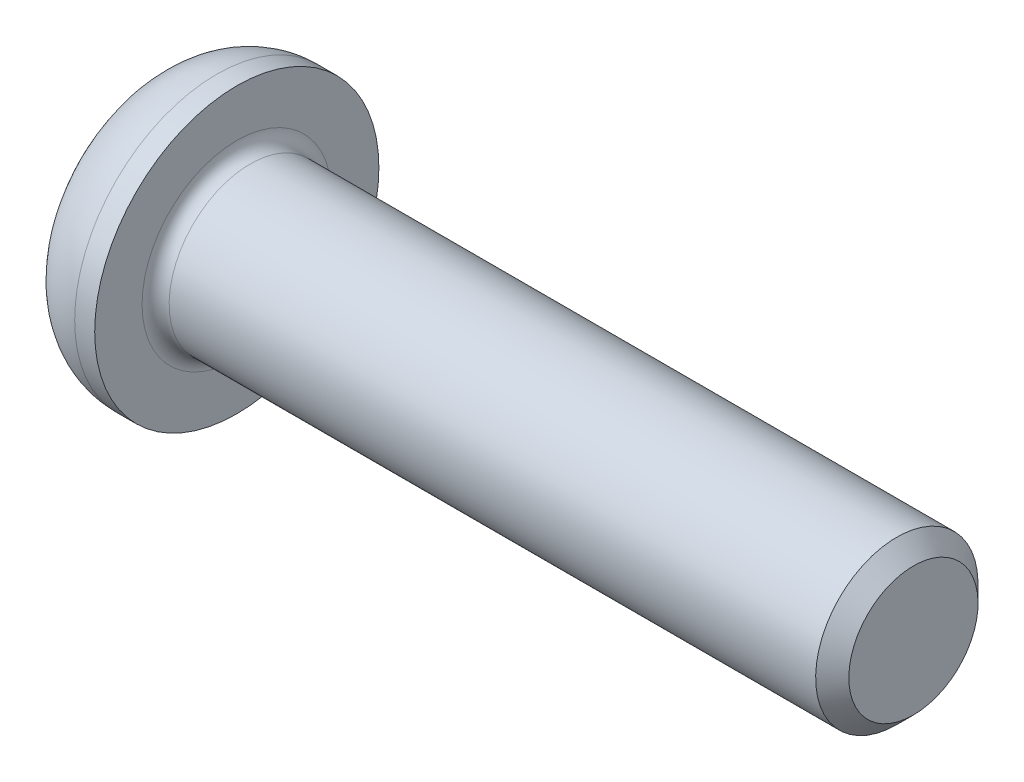
ISO-10303-21;
HEADER;
FILE_DESCRIPTION(('STEP AP214'),'2;1');
FILE_NAME('part.step','',(''),(''),'','','');
FILE_SCHEMA(('AUTOMOTIVE_DESIGN { 1 0 10303 214 1 1 1 1 }'));
ENDSEC;
DATA;
#1=APPLICATION_CONTEXT('core data for automotive mechanical design processes');
#2=APPLICATION_PROTOCOL_DEFINITION('international standard','automotive_design',2000,#1);
#3=PRODUCT_CONTEXT('',#1,'mechanical');
#4=PRODUCT('Part','Part','',(#3));
#5=PRODUCT_RELATED_PRODUCT_CATEGORY('part','',(#4));
#6=PRODUCT_DEFINITION_FORMATION('','',#4);
#7=PRODUCT_DEFINITION_CONTEXT('part definition',#1,'design');
#8=PRODUCT_DEFINITION('design','',#6,#7);
#9=PRODUCT_DEFINITION_SHAPE('','',#8);
#10=(LENGTH_UNIT() NAMED_UNIT(*) SI_UNIT(.MILLI.,.METRE.));
#11=(NAMED_UNIT(*) PLANE_ANGLE_UNIT() SI_UNIT($,.RADIAN.));
#12=(NAMED_UNIT(*) SI_UNIT($,.STERADIAN.) SOLID_ANGLE_UNIT());
#13=UNCERTAINTY_MEASURE_WITH_UNIT(LENGTH_MEASURE(1.E-05),#10,'distance_accuracy_value','');
#14=(GEOMETRIC_REPRESENTATION_CONTEXT(3) GLOBAL_UNCERTAINTY_ASSIGNED_CONTEXT((#13)) GLOBAL_UNIT_ASSIGNED_CONTEXT((#10,
#11,#12)) REPRESENTATION_CONTEXT('',''));
#15=CARTESIAN_POINT('',(0.,0.,0.));
#16=DIRECTION('',(0.,0.,1.));
#17=DIRECTION('',(1.,0.,0.));
#18=AXIS2_PLACEMENT_3D('',#15,#16,#17);
#19=CARTESIAN_POINT('',(25.,0.,0.));
#20=DIRECTION('',(-1.,0.,0.));
#21=DIRECTION('',(0.,-1.,0.));
#22=AXIS2_PLACEMENT_3D('',#19,#20,#21);
#23=PLANE('',#22);
#24=CARTESIAN_POINT('',(25.,0.,0.));
#25=DIRECTION('',(-1.,0.,0.));
#26=DIRECTION('',(0.,-1.,0.));
#27=AXIS2_PLACEMENT_3D('',#24,#25,#26);
#28=CIRCLE('',#27,2.38654999999999);
#29=CARTESIAN_POINT('',(25.,-2.38654999999999,0.));
#30=VERTEX_POINT('',#29);
#31=EDGE_CURVE('E63',#30,#30,#28,.F.);
#32=ORIENTED_EDGE('',*,*,#31,.T.);
#33=EDGE_LOOP('',(#32));
#34=FACE_BOUND('',#33,.T.);
#35=ADVANCED_FACE('F52',(#34),#23,.F.);
#36=CARTESIAN_POINT('',(0.113333333333338,0.,0.));
#37=DIRECTION('',(-1.,0.,0.));
#38=DIRECTION('',(0.,-1.,0.));
#39=AXIS2_PLACEMENT_3D('',#36,#37,#38);
#40=CYLINDRICAL_SURFACE('',#39,3.);
#41=CARTESIAN_POINT('',(0.500000000000002,0.,0.));
#42=DIRECTION('',(-1.,0.,0.));
#43=DIRECTION('',(0.,-1.,0.));
#44=AXIS2_PLACEMENT_3D('',#41,#42,#43);
#45=CIRCLE('',#44,3.);
#46=CARTESIAN_POINT('',(0.500000000000002,-3.,0.));
#47=VERTEX_POINT('',#46);
#48=EDGE_CURVE('E11',#47,#47,#45,.F.);
#49=ORIENTED_EDGE('',*,*,#48,.T.);
#50=EDGE_LOOP('',(#49));
#51=FACE_BOUND('',#50,.T.);
#52=CARTESIAN_POINT('',(24.38655,0.,0.));
#53=DIRECTION('',(-1.,0.,0.));
#54=DIRECTION('',(0.,-1.,0.));
#55=AXIS2_PLACEMENT_3D('',#52,#53,#54);
#56=CIRCLE('',#55,3.);
#57=CARTESIAN_POINT('',(24.38655,-3.,0.));
#58=VERTEX_POINT('',#57);
#59=EDGE_CURVE('E67',#58,#58,#56,.T.);
#60=ORIENTED_EDGE('',*,*,#59,.T.);
#61=EDGE_LOOP('',(#60));
#62=FACE_BOUND('',#61,.T.);
#63=ADVANCED_FACE('F86',(#51,#62),#40,.T.);
#64=CARTESIAN_POINT('',(0.,3.,0.));
#65=DIRECTION('',(-1.,0.,0.));
#66=DIRECTION('',(0.,-1.,0.));
#67=AXIS2_PLACEMENT_3D('',#64,#65,#66);
#68=PLANE('',#67);
#69=CARTESIAN_POINT('',(0.,0.,0.));
#70=DIRECTION('',(-1.,0.,0.));
#71=DIRECTION('',(0.,-1.,0.));
#72=AXIS2_PLACEMENT_3D('',#69,#70,#71);
#73=CIRCLE('',#72,3.5);
#74=CARTESIAN_POINT('',(0.,-3.5,0.));
#75=VERTEX_POINT('',#74);
#76=EDGE_CURVE('E59',#75,#75,#73,.T.);
#77=ORIENTED_EDGE('',*,*,#76,.T.);
#78=EDGE_LOOP('',(#77));
#79=FACE_BOUND('',#78,.T.);
#80=CARTESIAN_POINT('',(0.,0.,0.));
#81=DIRECTION('',(-1.,0.,0.));
#82=DIRECTION('',(0.,-1.,0.));
#83=AXIS2_PLACEMENT_3D('',#80,#81,#82);
#84=CIRCLE('',#83,5.25);
#85=CARTESIAN_POINT('',(0.,-5.25,0.));
#86=VERTEX_POINT('',#85);
#87=EDGE_CURVE('E78',#86,#86,#84,.T.);
#88=ORIENTED_EDGE('',*,*,#87,.F.);
#89=EDGE_LOOP('',(#88));
#90=FACE_BOUND('',#89,.T.);
#91=ADVANCED_FACE('F84',(#79,#90),#68,.F.);
#92=CARTESIAN_POINT('',(0.113333333333338,0.,0.));
#93=DIRECTION('',(-1.,0.,0.));
#94=DIRECTION('',(0.,-1.,0.));
#95=AXIS2_PLACEMENT_3D('',#92,#93,#94);
#96=CYLINDRICAL_SURFACE('',#95,5.25);
#97=CARTESIAN_POINT('',(-0.739999999999996,0.,0.));
#98=DIRECTION('',(1.,0.,0.));
#99=DIRECTION('',(0.,1.,0.));
#100=AXIS2_PLACEMENT_3D('',#97,#98,#99);
#101=CIRCLE('',#100,5.25);
#102=CARTESIAN_POINT('',(-0.739999999999996,5.25,0.));
#103=VERTEX_POINT('',#102);
#104=EDGE_CURVE('E72',#103,#103,#101,.T.);
#105=ORIENTED_EDGE('',*,*,#104,.T.);
#106=EDGE_LOOP('',(#105));
#107=FACE_BOUND('',#106,.T.);
#108=ORIENTED_EDGE('',*,*,#87,.T.);
#109=EDGE_LOOP('',(#108));
#110=FACE_BOUND('',#109,.T.);
#111=ADVANCED_FACE('F82',(#107,#110),#96,.T.);
#112=CARTESIAN_POINT('',(-3.3,5.25,0.));
#113=DIRECTION('',(1.,0.,0.));
#114=DIRECTION('',(0.,1.,0.));
#115=AXIS2_PLACEMENT_3D('',#112,#113,#114);
#116=PLANE('',#115);
#117=CARTESIAN_POINT('',(-3.3,0.,0.));
#118=DIRECTION('',(1.,0.,0.));
#119=DIRECTION('',(0.,1.,0.));
#120=AXIS2_PLACEMENT_3D('',#117,#118,#119);
#121=CIRCLE('',#120,2.69);
#122=CARTESIAN_POINT('',(-3.3,2.69,0.));
#123=VERTEX_POINT('',#122);
#124=EDGE_CURVE('E75',#123,#123,#121,.F.);
#125=ORIENTED_EDGE('',*,*,#124,.T.);
#126=EDGE_LOOP('',(#125));
#127=FACE_BOUND('',#126,.T.);
#128=ADVANCED_FACE('F92',(#127),#116,.F.);
#129=CARTESIAN_POINT('',(-0.739999999999996,0.,0.));
#130=DIRECTION('',(1.,0.,0.));
#131=DIRECTION('',(0.,1.,0.));
#132=AXIS2_PLACEMENT_3D('',#129,#130,#131);
#133=TOROIDAL_SURFACE('',#132,2.69,2.56);
#134=ORIENTED_EDGE('',*,*,#104,.F.);
#135=EDGE_LOOP('',(#134));
#136=FACE_BOUND('',#135,.T.);
#137=ORIENTED_EDGE('',*,*,#124,.F.);
#138=EDGE_LOOP('',(#137));
#139=FACE_BOUND('',#138,.T.);
#140=ADVANCED_FACE('F102',(#136,#139),#133,.T.);
#141=CARTESIAN_POINT('',(24.38655,0.,0.));
#142=DIRECTION('',(-1.,0.,0.));
#143=DIRECTION('',(0.,-1.,0.));
#144=AXIS2_PLACEMENT_3D('',#141,#142,#143);
#145=CONICAL_SURFACE('',#144,3.,0.785398163397448);
#146=ORIENTED_EDGE('',*,*,#31,.F.);
#147=EDGE_LOOP('',(#146));
#148=FACE_BOUND('',#147,.T.);
#149=ORIENTED_EDGE('',*,*,#59,.F.);
#150=EDGE_LOOP('',(#149));
#151=FACE_BOUND('',#150,.T.);
#152=ADVANCED_FACE('F104',(#148,#151),#145,.T.);
#153=CARTESIAN_POINT('',(0.500000000000002,0.,0.));
#154=DIRECTION('',(-1.,0.,0.));
#155=DIRECTION('',(0.,-1.,0.));
#156=AXIS2_PLACEMENT_3D('',#153,#154,#155);
#157=TOROIDAL_SURFACE('',#156,3.5,0.5);
#158=ORIENTED_EDGE('',*,*,#48,.F.);
#159=EDGE_LOOP('',(#158));
#160=FACE_BOUND('',#159,.T.);
#161=ORIENTED_EDGE('',*,*,#76,.F.);
#162=EDGE_LOOP('',(#161));
#163=FACE_BOUND('',#162,.T.);
#164=ADVANCED_FACE('F54',(#160,#163),#157,.F.);
#165=CLOSED_SHELL('',(#35,#63,#91,#111,#128,#140,#152,#164));
#166=MANIFOLD_SOLID_BREP('B2',#165);
#167=ADVANCED_BREP_SHAPE_REPRESENTATION('',(#18,#166),#14);
#168=SHAPE_DEFINITION_REPRESENTATION(#9,#167);
ENDSEC;
END-ISO-10303-21;
